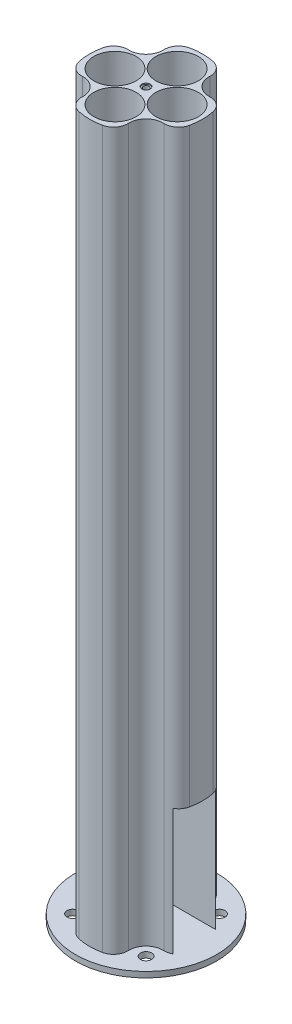
ISO-10303-21;
HEADER;
FILE_DESCRIPTION(('STEP AP214'),'2;1');
FILE_NAME('part.step','',(''),(''),'','','');
FILE_SCHEMA(('AUTOMOTIVE_DESIGN { 1 0 10303 214 1 1 1 1 }'));
ENDSEC;
DATA;
#1=APPLICATION_CONTEXT('core data for automotive mechanical design processes');
#2=APPLICATION_PROTOCOL_DEFINITION('international standard','automotive_design',2000,#1);
#3=PRODUCT_CONTEXT('',#1,'mechanical');
#4=PRODUCT('Part','Part','',(#3));
#5=PRODUCT_RELATED_PRODUCT_CATEGORY('part','',(#4));
#6=PRODUCT_DEFINITION_FORMATION('','',#4);
#7=PRODUCT_DEFINITION_CONTEXT('part definition',#1,'design');
#8=PRODUCT_DEFINITION('design','',#6,#7);
#9=PRODUCT_DEFINITION_SHAPE('','',#8);
#10=(LENGTH_UNIT() NAMED_UNIT(*) SI_UNIT(.MILLI.,.METRE.));
#11=(NAMED_UNIT(*) PLANE_ANGLE_UNIT() SI_UNIT($,.RADIAN.));
#12=(NAMED_UNIT(*) SI_UNIT($,.STERADIAN.) SOLID_ANGLE_UNIT());
#13=UNCERTAINTY_MEASURE_WITH_UNIT(LENGTH_MEASURE(1.E-05),#10,'distance_accuracy_value','');
#14=(GEOMETRIC_REPRESENTATION_CONTEXT(3) GLOBAL_UNCERTAINTY_ASSIGNED_CONTEXT((#13)) GLOBAL_UNIT_ASSIGNED_CONTEXT((#10,
#11,#12)) REPRESENTATION_CONTEXT('',''));
#15=CARTESIAN_POINT('',(0.,0.,0.));
#16=DIRECTION('',(0.,0.,1.));
#17=DIRECTION('',(1.,0.,0.));
#18=AXIS2_PLACEMENT_3D('',#15,#16,#17);
#19=CARTESIAN_POINT('',(73.3291144916706,0.,-15.7429656630339));
#20=DIRECTION('',(0.,-1.,0.));
#21=DIRECTION('',(0.,0.,-1.));
#22=AXIS2_PLACEMENT_3D('',#19,#20,#21);
#23=CYLINDRICAL_SURFACE('',#22,25.);
#24=DIRECTION('',(0.,-1.,0.));
#25=VECTOR('',#24,1.);
#26=CARTESIAN_POINT('',(97.7721526555608,1120.,-20.9906208840452));
#27=LINE('',#26,#25);
#28=CARTESIAN_POINT('',(97.7721526555608,10.,-20.9906208840452));
#29=VERTEX_POINT('',#28);
#30=CARTESIAN_POINT('',(97.7721526555608,1055.,-20.9906208840452));
#31=VERTEX_POINT('',#30);
#32=EDGE_CURVE('E367',#29,#31,#27,.F.);
#33=ORIENTED_EDGE('',*,*,#32,.F.);
#34=CARTESIAN_POINT('',(73.3291144916706,10.,-15.7429656630339));
#35=DIRECTION('',(0.,-1.,0.));
#36=DIRECTION('',(0.,0.,-1.));
#37=AXIS2_PLACEMENT_3D('',#34,#35,#36);
#38=CIRCLE('',#37,25.);
#39=CARTESIAN_POINT('',(85.642987028776,10.,-37.5));
#40=VERTEX_POINT('',#39);
#41=EDGE_CURVE('E404',#29,#40,#38,.F.);
#42=ORIENTED_EDGE('',*,*,#41,.T.);
#43=DIRECTION('',(0.,-1.,0.));
#44=VECTOR('',#43,1.);
#45=CARTESIAN_POINT('',(85.642987028776,0.,-37.5));
#46=LINE('',#45,#44);
#47=CARTESIAN_POINT('',(85.642987028776,-213.21458,-37.5));
#48=VERTEX_POINT('',#47);
#49=EDGE_CURVE('E215',#40,#48,#46,.T.);
#50=ORIENTED_EDGE('',*,*,#49,.T.);
#51=CARTESIAN_POINT('',(73.3291144916706,-213.21458,-15.7429656630339));
#52=DIRECTION('',(0.,-1.,0.));
#53=DIRECTION('',(0.,0.,-1.));
#54=AXIS2_PLACEMENT_3D('',#51,#52,#53);
#55=CIRCLE('',#54,25.);
#56=CARTESIAN_POINT('',(72.1395659128402,-213.21458,-40.7146491100625));
#57=VERTEX_POINT('',#56);
#58=EDGE_CURVE('E226',#48,#57,#55,.F.);
#59=ORIENTED_EDGE('',*,*,#58,.T.);
#60=DIRECTION('',(0.,1.,0.));
#61=VECTOR('',#60,1.);
#62=CARTESIAN_POINT('',(72.1395659128402,0.,-40.7146491100625));
#63=LINE('',#62,#61);
#64=CARTESIAN_POINT('',(72.1395659128402,1055.,-40.7146491100625));
#65=VERTEX_POINT('',#64);
#66=EDGE_CURVE('E359',#65,#57,#63,.F.);
#67=ORIENTED_EDGE('',*,*,#66,.F.);
#68=CARTESIAN_POINT('',(73.3291144916706,1055.,-15.7429656630339));
#69=DIRECTION('',(0.,-1.,0.));
#70=DIRECTION('',(0.,0.,-1.));
#71=AXIS2_PLACEMENT_3D('',#68,#69,#70);
#72=CIRCLE('',#71,25.);
#73=EDGE_CURVE('E290',#31,#65,#72,.F.);
#74=ORIENTED_EDGE('',*,*,#73,.F.);
#75=EDGE_LOOP('',(#33,#42,#50,#59,#67,#74));
#76=FACE_BOUND('',#75,.T.);
#77=ADVANCED_FACE('F65',(#76),#23,.T.);
#78=CARTESIAN_POINT('',(-73.3291144916707,1120.,-15.7429656630334));
#79=DIRECTION('',(0.,-1.,0.));
#80=DIRECTION('',(0.,0.,-1.));
#81=AXIS2_PLACEMENT_3D('',#78,#79,#80);
#82=CYLINDRICAL_SURFACE('',#81,25.);
#83=DIRECTION('',(0.,-1.,0.));
#84=VECTOR('',#83,1.);
#85=CARTESIAN_POINT('',(-85.6429870287752,1120.,-37.5));
#86=LINE('',#85,#84);
#87=CARTESIAN_POINT('',(-85.6429870287752,-213.21458,-37.5));
#88=VERTEX_POINT('',#87);
#89=CARTESIAN_POINT('',(-85.6429870287752,10.,-37.5));
#90=VERTEX_POINT('',#89);
#91=EDGE_CURVE('E205',#88,#90,#86,.F.);
#92=ORIENTED_EDGE('',*,*,#91,.T.);
#93=CARTESIAN_POINT('',(-73.3291144916707,10.,-15.7429656630334));
#94=DIRECTION('',(0.,-1.,0.));
#95=DIRECTION('',(0.,0.,-1.));
#96=AXIS2_PLACEMENT_3D('',#93,#94,#95);
#97=CIRCLE('',#96,25.);
#98=CARTESIAN_POINT('',(-97.772152655561,10.,-20.9906208840445));
#99=VERTEX_POINT('',#98);
#100=EDGE_CURVE('E388',#90,#99,#97,.F.);
#101=ORIENTED_EDGE('',*,*,#100,.T.);
#102=DIRECTION('',(0.,-1.,0.));
#103=VECTOR('',#102,1.);
#104=CARTESIAN_POINT('',(-97.772152655561,1120.,-20.9906208840445));
#105=LINE('',#104,#103);
#106=CARTESIAN_POINT('',(-97.772152655561,1055.,-20.9906208840445));
#107=VERTEX_POINT('',#106);
#108=EDGE_CURVE('E345',#107,#99,#105,.T.);
#109=ORIENTED_EDGE('',*,*,#108,.F.);
#110=CARTESIAN_POINT('',(-73.3291144916707,1055.,-15.7429656630334));
#111=DIRECTION('',(0.,-1.,0.));
#112=DIRECTION('',(0.,0.,-1.));
#113=AXIS2_PLACEMENT_3D('',#110,#111,#112);
#114=CIRCLE('',#113,25.);
#115=CARTESIAN_POINT('',(-72.1395659128405,1055.,-40.714649110062));
#116=VERTEX_POINT('',#115);
#117=EDGE_CURVE('E302',#116,#107,#114,.F.);
#118=ORIENTED_EDGE('',*,*,#117,.F.);
#119=DIRECTION('',(0.,1.,0.));
#120=VECTOR('',#119,1.);
#121=CARTESIAN_POINT('',(-72.1395659128405,0.,-40.714649110062));
#122=LINE('',#121,#120);
#123=CARTESIAN_POINT('',(-72.1395659128405,-213.21458,-40.714649110062));
#124=VERTEX_POINT('',#123);
#125=EDGE_CURVE('E232',#124,#116,#122,.T.);
#126=ORIENTED_EDGE('',*,*,#125,.F.);
#127=CARTESIAN_POINT('',(-73.3291144916707,-213.21458,-15.7429656630334));
#128=DIRECTION('',(0.,-1.,0.));
#129=DIRECTION('',(0.,0.,-1.));
#130=AXIS2_PLACEMENT_3D('',#127,#128,#129);
#131=CIRCLE('',#130,25.);
#132=EDGE_CURVE('E224',#124,#88,#131,.F.);
#133=ORIENTED_EDGE('',*,*,#132,.T.);
#134=EDGE_LOOP('',(#92,#101,#109,#118,#126,#133));
#135=FACE_BOUND('',#134,.T.);
#136=ADVANCED_FACE('F230',(#135),#82,.T.);
#137=CARTESIAN_POINT('',(0.,1120.,0.));
#138=DIRECTION('',(0.,-1.,0.));
#139=DIRECTION('',(0.,0.,-1.));
#140=AXIS2_PLACEMENT_3D('',#137,#138,#139);
#141=CYLINDRICAL_SURFACE('',#140,100.);
#142=CARTESIAN_POINT('',(0.,10.,0.));
#143=DIRECTION('',(0.,-1.,0.));
#144=DIRECTION('',(0.,0.,-1.));
#145=AXIS2_PLACEMENT_3D('',#142,#143,#144);
#146=CIRCLE('',#145,100.);
#147=CARTESIAN_POINT('',(97.7721526555608,10.,20.9906208840452));
#148=VERTEX_POINT('',#147);
#149=EDGE_CURVE('E402',#29,#148,#146,.T.);
#150=ORIENTED_EDGE('',*,*,#149,.F.);
#151=ORIENTED_EDGE('',*,*,#32,.T.);
#152=CARTESIAN_POINT('',(0.,1055.,0.));
#153=DIRECTION('',(0.,-1.,0.));
#154=DIRECTION('',(0.,0.,-1.));
#155=AXIS2_PLACEMENT_3D('',#152,#153,#154);
#156=CIRCLE('',#155,100.);
#157=CARTESIAN_POINT('',(97.7721526555608,1055.,20.9906208840452));
#158=VERTEX_POINT('',#157);
#159=EDGE_CURVE('E287',#31,#158,#156,.T.);
#160=ORIENTED_EDGE('',*,*,#159,.T.);
#161=DIRECTION('',(0.,-1.,0.));
#162=VECTOR('',#161,1.);
#163=CARTESIAN_POINT('',(97.7721526555608,1120.,20.9906208840452));
#164=LINE('',#163,#162);
#165=EDGE_CURVE('E364',#158,#148,#164,.T.);
#166=ORIENTED_EDGE('',*,*,#165,.T.);
#167=EDGE_LOOP('',(#150,#151,#160,#166));
#168=FACE_BOUND('',#167,.T.);
#169=ADVANCED_FACE('F438',(#168),#141,.T.);
#170=CARTESIAN_POINT('',(0.,10.,0.));
#171=DIRECTION('',(0.,-1.,0.));
#172=DIRECTION('',(0.,0.,-1.));
#173=AXIS2_PLACEMENT_3D('',#170,#171,#172);
#174=CIRCLE('',#173,100.);
#175=CARTESIAN_POINT('',(-97.772152655561,10.,20.9906208840445));
#176=VERTEX_POINT('',#175);
#177=EDGE_CURVE('E386',#176,#99,#174,.T.);
#178=ORIENTED_EDGE('',*,*,#177,.F.);
#179=DIRECTION('',(0.,-1.,0.));
#180=VECTOR('',#179,1.);
#181=CARTESIAN_POINT('',(-97.772152655561,1120.,20.9906208840446));
#182=LINE('',#181,#180);
#183=CARTESIAN_POINT('',(-97.772152655561,1055.,20.9906208840446));
#184=VERTEX_POINT('',#183);
#185=EDGE_CURVE('E348',#176,#184,#182,.F.);
#186=ORIENTED_EDGE('',*,*,#185,.T.);
#187=CARTESIAN_POINT('',(0.,1055.,0.));
#188=DIRECTION('',(0.,-1.,0.));
#189=DIRECTION('',(0.,0.,-1.));
#190=AXIS2_PLACEMENT_3D('',#187,#188,#189);
#191=CIRCLE('',#190,100.);
#192=EDGE_CURVE('E297',#184,#107,#191,.T.);
#193=ORIENTED_EDGE('',*,*,#192,.T.);
#194=ORIENTED_EDGE('',*,*,#108,.T.);
#195=EDGE_LOOP('',(#178,#186,#193,#194));
#196=FACE_BOUND('',#195,.T.);
#197=ADVANCED_FACE('F381',(#196),#141,.T.);
#198=CARTESIAN_POINT('',(0.,-79.9999999999998,0.));
#199=DIRECTION('',(0.,1.,0.));
#200=DIRECTION('',(0.,0.,1.));
#201=AXIS2_PLACEMENT_3D('',#198,#199,#200);
#202=CYLINDRICAL_SURFACE('',#201,5.);
#203=CARTESIAN_POINT('',(0.,1053.,0.));
#204=DIRECTION('',(0.,1.,0.));
#205=DIRECTION('',(0.,0.,1.));
#206=AXIS2_PLACEMENT_3D('',#203,#204,#205);
#207=CIRCLE('',#206,5.);
#208=CARTESIAN_POINT('',(0.,1053.,5.));
#209=VERTEX_POINT('',#208);
#210=EDGE_CURVE('E271',#209,#209,#207,.F.);
#211=ORIENTED_EDGE('',*,*,#210,.F.);
#212=EDGE_LOOP('',(#211));
#213=FACE_BOUND('',#212,.T.);
#214=CARTESIAN_POINT('',(0.,10.,0.));
#215=DIRECTION('',(0.,-1.,0.));
#216=DIRECTION('',(0.,0.,-1.));
#217=AXIS2_PLACEMENT_3D('',#214,#215,#216);
#218=CIRCLE('',#217,5.);
#219=CARTESIAN_POINT('',(0.,10.,-5.));
#220=VERTEX_POINT('',#219);
#221=EDGE_CURVE('E69',#220,#220,#218,.F.);
#222=ORIENTED_EDGE('',*,*,#221,.F.);
#223=EDGE_LOOP('',(#222));
#224=FACE_BOUND('',#223,.T.);
#225=ADVANCED_FACE('F377',(#213,#224),#202,.F.);
#226=CARTESIAN_POINT('',(-73.3291144916707,0.,15.7429656630334));
#227=DIRECTION('',(0.,-1.,0.));
#228=DIRECTION('',(0.,0.,-1.));
#229=AXIS2_PLACEMENT_3D('',#226,#227,#228);
#230=CYLINDRICAL_SURFACE('',#229,25.);
#231=DIRECTION('',(0.,-1.,0.));
#232=VECTOR('',#231,1.);
#233=CARTESIAN_POINT('',(-85.6429870287752,0.,37.5));
#234=LINE('',#233,#232);
#235=CARTESIAN_POINT('',(-85.6429870287752,-213.21458,37.5));
#236=VERTEX_POINT('',#235);
#237=CARTESIAN_POINT('',(-85.6429870287752,10.,37.5));
#238=VERTEX_POINT('',#237);
#239=EDGE_CURVE('E387',#236,#238,#234,.F.);
#240=ORIENTED_EDGE('',*,*,#239,.F.);
#241=CARTESIAN_POINT('',(-73.3291144916707,-213.21458,15.7429656630334));
#242=DIRECTION('',(0.,-1.,0.));
#243=DIRECTION('',(0.,0.,-1.));
#244=AXIS2_PLACEMENT_3D('',#241,#242,#243);
#245=CIRCLE('',#244,25.);
#246=CARTESIAN_POINT('',(-72.1395659128405,-213.21458,40.714649110062));
#247=VERTEX_POINT('',#246);
#248=EDGE_CURVE('E82',#236,#247,#245,.F.);
#249=ORIENTED_EDGE('',*,*,#248,.T.);
#250=DIRECTION('',(0.,1.,0.));
#251=VECTOR('',#250,1.);
#252=CARTESIAN_POINT('',(-72.1395659128405,0.,40.714649110062));
#253=LINE('',#252,#251);
#254=CARTESIAN_POINT('',(-72.1395659128405,1055.,40.714649110062));
#255=VERTEX_POINT('',#254);
#256=EDGE_CURVE('E336',#255,#247,#253,.F.);
#257=ORIENTED_EDGE('',*,*,#256,.F.);
#258=CARTESIAN_POINT('',(-73.3291144916707,1055.,15.7429656630334));
#259=DIRECTION('',(0.,-1.,0.));
#260=DIRECTION('',(0.,0.,-1.));
#261=AXIS2_PLACEMENT_3D('',#258,#259,#260);
#262=CIRCLE('',#261,25.);
#263=EDGE_CURVE('E292',#184,#255,#262,.F.);
#264=ORIENTED_EDGE('',*,*,#263,.F.);
#265=ORIENTED_EDGE('',*,*,#185,.F.);
#266=CARTESIAN_POINT('',(-73.3291144916707,10.,15.7429656630334));
#267=DIRECTION('',(0.,-1.,0.));
#268=DIRECTION('',(0.,0.,-1.));
#269=AXIS2_PLACEMENT_3D('',#266,#267,#268);
#270=CIRCLE('',#269,25.);
#271=EDGE_CURVE('E399',#176,#238,#270,.F.);
#272=ORIENTED_EDGE('',*,*,#271,.T.);
#273=EDGE_LOOP('',(#240,#249,#257,#264,#265,#272));
#274=FACE_BOUND('',#273,.T.);
#275=ADVANCED_FACE('F380',(#274),#230,.T.);
#276=CARTESIAN_POINT('',(-15.7429656630342,1120.,73.3291144916706));
#277=DIRECTION('',(0.,-1.,0.));
#278=DIRECTION('',(0.,0.,-1.));
#279=AXIS2_PLACEMENT_3D('',#276,#277,#278);
#280=CYLINDRICAL_SURFACE('',#279,25.);
#281=DIRECTION('',(0.,1.,0.));
#282=VECTOR('',#281,1.);
#283=CARTESIAN_POINT('',(-40.7146491100628,0.,72.1395659128401));
#284=LINE('',#283,#282);
#285=CARTESIAN_POINT('',(-40.7146491100628,-213.21458,72.1395659128401));
#286=VERTEX_POINT('',#285);
#287=CARTESIAN_POINT('',(-40.7146491100628,1055.,72.1395659128401));
#288=VERTEX_POINT('',#287);
#289=EDGE_CURVE('E338',#286,#288,#284,.T.);
#290=ORIENTED_EDGE('',*,*,#289,.F.);
#291=CARTESIAN_POINT('',(-15.7429656630342,-213.21458,73.3291144916706));
#292=DIRECTION('',(0.,-1.,0.));
#293=DIRECTION('',(0.,0.,-1.));
#294=AXIS2_PLACEMENT_3D('',#291,#292,#293);
#295=CIRCLE('',#294,25.);
#296=CARTESIAN_POINT('',(-20.9906208840455,-213.21458,97.7721526555607));
#297=VERTEX_POINT('',#296);
#298=EDGE_CURVE('E246',#286,#297,#295,.F.);
#299=ORIENTED_EDGE('',*,*,#298,.T.);
#300=DIRECTION('',(0.,-1.,0.));
#301=VECTOR('',#300,1.);
#302=CARTESIAN_POINT('',(-20.9906208840455,1120.,97.7721526555607));
#303=LINE('',#302,#301);
#304=CARTESIAN_POINT('',(-20.9906208840455,1055.,97.7721526555607));
#305=VERTEX_POINT('',#304);
#306=EDGE_CURVE('E342',#305,#297,#303,.T.);
#307=ORIENTED_EDGE('',*,*,#306,.F.);
#308=CARTESIAN_POINT('',(-15.7429656630342,1055.,73.3291144916706));
#309=DIRECTION('',(0.,-1.,0.));
#310=DIRECTION('',(0.,0.,-1.));
#311=AXIS2_PLACEMENT_3D('',#308,#309,#310);
#312=CIRCLE('',#311,25.);
#313=EDGE_CURVE('E282',#288,#305,#312,.F.);
#314=ORIENTED_EDGE('',*,*,#313,.F.);
#315=EDGE_LOOP('',(#290,#299,#307,#314));
#316=FACE_BOUND('',#315,.T.);
#317=ADVANCED_FACE('F660',(#316),#280,.T.);
#318=CARTESIAN_POINT('',(-70.7106781186551,0.,70.7106781186544));
#319=DIRECTION('',(0.,1.,0.));
#320=DIRECTION('',(0.,0.,1.));
#321=AXIS2_PLACEMENT_3D('',#318,#319,#320);
#322=CYLINDRICAL_SURFACE('',#321,30.0300429006135);
#323=CARTESIAN_POINT('',(-70.7106781186551,-213.21458,70.7106781186544));
#324=DIRECTION('',(0.,-1.,0.));
#325=DIRECTION('',(0.,0.,-1.));
#326=AXIS2_PLACEMENT_3D('',#323,#324,#325);
#327=CIRCLE('',#326,30.0300429006135);
#328=EDGE_CURVE('E89',#286,#247,#327,.F.);
#329=ORIENTED_EDGE('',*,*,#328,.F.);
#330=ORIENTED_EDGE('',*,*,#289,.T.);
#331=CARTESIAN_POINT('',(-70.7106781186551,1055.,70.7106781186544));
#332=DIRECTION('',(0.,-1.,0.));
#333=DIRECTION('',(0.,0.,-1.));
#334=AXIS2_PLACEMENT_3D('',#331,#332,#333);
#335=CIRCLE('',#334,30.0300429006135);
#336=EDGE_CURVE('E284',#288,#255,#335,.F.);
#337=ORIENTED_EDGE('',*,*,#336,.T.);
#338=ORIENTED_EDGE('',*,*,#256,.T.);
#339=EDGE_LOOP('',(#329,#330,#337,#338));
#340=FACE_BOUND('',#339,.T.);
#341=ADVANCED_FACE('F453',(#340),#322,.F.);
#342=CARTESIAN_POINT('',(15.7429656630337,0.,73.3291144916707));
#343=DIRECTION('',(0.,-1.,0.));
#344=DIRECTION('',(0.,0.,-1.));
#345=AXIS2_PLACEMENT_3D('',#342,#343,#344);
#346=CYLINDRICAL_SURFACE('',#345,25.);
#347=DIRECTION('',(0.,-1.,0.));
#348=VECTOR('',#347,1.);
#349=CARTESIAN_POINT('',(20.9906208840449,1120.,97.7721526555609));
#350=LINE('',#349,#348);
#351=CARTESIAN_POINT('',(20.9906208840449,-213.21458,97.7721526555609));
#352=VERTEX_POINT('',#351);
#353=CARTESIAN_POINT('',(20.9906208840449,1055.,97.7721526555609));
#354=VERTEX_POINT('',#353);
#355=EDGE_CURVE('E340',#352,#354,#350,.F.);
#356=ORIENTED_EDGE('',*,*,#355,.F.);
#357=CARTESIAN_POINT('',(15.7429656630337,-213.21458,73.3291144916707));
#358=DIRECTION('',(0.,-1.,0.));
#359=DIRECTION('',(0.,0.,-1.));
#360=AXIS2_PLACEMENT_3D('',#357,#358,#359);
#361=CIRCLE('',#360,25.);
#362=CARTESIAN_POINT('',(40.7146491100623,-213.21458,72.1395659128404));
#363=VERTEX_POINT('',#362);
#364=EDGE_CURVE('E256',#352,#363,#361,.F.);
#365=ORIENTED_EDGE('',*,*,#364,.T.);
#366=DIRECTION('',(0.,1.,0.));
#367=VECTOR('',#366,1.);
#368=CARTESIAN_POINT('',(40.7146491100623,0.,72.1395659128404));
#369=LINE('',#368,#367);
#370=CARTESIAN_POINT('',(40.7146491100623,1055.,72.1395659128404));
#371=VERTEX_POINT('',#370);
#372=EDGE_CURVE('E369',#371,#363,#369,.F.);
#373=ORIENTED_EDGE('',*,*,#372,.F.);
#374=CARTESIAN_POINT('',(15.7429656630337,1055.,73.3291144916707));
#375=DIRECTION('',(0.,-1.,0.));
#376=DIRECTION('',(0.,0.,-1.));
#377=AXIS2_PLACEMENT_3D('',#374,#375,#376);
#378=CIRCLE('',#377,25.);
#379=EDGE_CURVE('E12',#354,#371,#378,.F.);
#380=ORIENTED_EDGE('',*,*,#379,.F.);
#381=EDGE_LOOP('',(#356,#365,#373,#380));
#382=FACE_BOUND('',#381,.T.);
#383=ADVANCED_FACE('F67',(#382),#346,.T.);
#384=CARTESIAN_POINT('',(73.3291144916706,1120.,15.7429656630339));
#385=DIRECTION('',(0.,-1.,0.));
#386=DIRECTION('',(0.,0.,-1.));
#387=AXIS2_PLACEMENT_3D('',#384,#385,#386);
#388=CYLINDRICAL_SURFACE('',#387,25.);
#389=DIRECTION('',(0.,-1.,0.));
#390=VECTOR('',#389,1.);
#391=CARTESIAN_POINT('',(85.642987028776,1120.,37.5));
#392=LINE('',#391,#390);
#393=CARTESIAN_POINT('',(85.642987028776,10.,37.5));
#394=VERTEX_POINT('',#393);
#395=CARTESIAN_POINT('',(85.642987028776,-213.21458,37.5));
#396=VERTEX_POINT('',#395);
#397=EDGE_CURVE('E390',#394,#396,#392,.T.);
#398=ORIENTED_EDGE('',*,*,#397,.F.);
#399=CARTESIAN_POINT('',(73.3291144916706,10.,15.7429656630339));
#400=DIRECTION('',(0.,-1.,0.));
#401=DIRECTION('',(0.,0.,-1.));
#402=AXIS2_PLACEMENT_3D('',#399,#400,#401);
#403=CIRCLE('',#402,25.);
#404=EDGE_CURVE('E407',#394,#148,#403,.F.);
#405=ORIENTED_EDGE('',*,*,#404,.T.);
#406=ORIENTED_EDGE('',*,*,#165,.F.);
#407=CARTESIAN_POINT('',(73.3291144916706,1055.,15.7429656630339));
#408=DIRECTION('',(0.,-1.,0.));
#409=DIRECTION('',(0.,0.,-1.));
#410=AXIS2_PLACEMENT_3D('',#407,#408,#409);
#411=CIRCLE('',#410,25.);
#412=CARTESIAN_POINT('',(72.1395659128402,1055.,40.7146491100625));
#413=VERTEX_POINT('',#412);
#414=EDGE_CURVE('E280',#413,#158,#411,.F.);
#415=ORIENTED_EDGE('',*,*,#414,.F.);
#416=DIRECTION('',(0.,1.,0.));
#417=VECTOR('',#416,1.);
#418=CARTESIAN_POINT('',(72.1395659128402,0.,40.7146491100625));
#419=LINE('',#418,#417);
#420=CARTESIAN_POINT('',(72.1395659128402,-213.21458,40.7146491100625));
#421=VERTEX_POINT('',#420);
#422=EDGE_CURVE('E74',#421,#413,#419,.T.);
#423=ORIENTED_EDGE('',*,*,#422,.F.);
#424=CARTESIAN_POINT('',(73.3291144916706,-213.21458,15.7429656630339));
#425=DIRECTION('',(0.,-1.,0.));
#426=DIRECTION('',(0.,0.,-1.));
#427=AXIS2_PLACEMENT_3D('',#424,#425,#426);
#428=CIRCLE('',#427,25.);
#429=EDGE_CURVE('E264',#421,#396,#428,.F.);
#430=ORIENTED_EDGE('',*,*,#429,.T.);
#431=EDGE_LOOP('',(#398,#405,#406,#415,#423,#430));
#432=FACE_BOUND('',#431,.T.);
#433=ADVANCED_FACE('F444',(#432),#388,.T.);
#434=CARTESIAN_POINT('',(70.7106781186546,0.,70.7106781186549));
#435=DIRECTION('',(0.,1.,0.));
#436=DIRECTION('',(0.,0.,1.));
#437=AXIS2_PLACEMENT_3D('',#434,#435,#436);
#438=CYLINDRICAL_SURFACE('',#437,30.0300429006135);
#439=CARTESIAN_POINT('',(70.7106781186546,-213.21458,70.7106781186549));
#440=DIRECTION('',(0.,-1.,0.));
#441=DIRECTION('',(0.,0.,-1.));
#442=AXIS2_PLACEMENT_3D('',#439,#440,#441);
#443=CIRCLE('',#442,30.0300429006135);
#444=EDGE_CURVE('E261',#421,#363,#443,.F.);
#445=ORIENTED_EDGE('',*,*,#444,.F.);
#446=ORIENTED_EDGE('',*,*,#422,.T.);
#447=CARTESIAN_POINT('',(70.7106781186546,1055.,70.7106781186549));
#448=DIRECTION('',(0.,-1.,0.));
#449=DIRECTION('',(0.,0.,-1.));
#450=AXIS2_PLACEMENT_3D('',#447,#448,#449);
#451=CIRCLE('',#450,30.0300429006135);
#452=EDGE_CURVE('E274',#413,#371,#451,.F.);
#453=ORIENTED_EDGE('',*,*,#452,.T.);
#454=ORIENTED_EDGE('',*,*,#372,.T.);
#455=EDGE_LOOP('',(#445,#446,#453,#454));
#456=FACE_BOUND('',#455,.T.);
#457=ADVANCED_FACE('F446',(#456),#438,.F.);
#458=CARTESIAN_POINT('',(15.7429656630337,1120.,-73.3291144916707));
#459=DIRECTION('',(0.,-1.,0.));
#460=DIRECTION('',(0.,0.,-1.));
#461=AXIS2_PLACEMENT_3D('',#458,#459,#460);
#462=CYLINDRICAL_SURFACE('',#461,25.);
#463=DIRECTION('',(0.,1.,0.));
#464=VECTOR('',#463,1.);
#465=CARTESIAN_POINT('',(40.7146491100623,0.,-72.1395659128404));
#466=LINE('',#465,#464);
#467=CARTESIAN_POINT('',(40.7146491100623,-213.21458,-72.1395659128404));
#468=VERTEX_POINT('',#467);
#469=CARTESIAN_POINT('',(40.7146491100623,1055.,-72.1395659128404));
#470=VERTEX_POINT('',#469);
#471=EDGE_CURVE('E362',#468,#470,#466,.T.);
#472=ORIENTED_EDGE('',*,*,#471,.F.);
#473=CARTESIAN_POINT('',(15.7429656630337,-213.21458,-73.3291144916707));
#474=DIRECTION('',(0.,-1.,0.));
#475=DIRECTION('',(0.,0.,-1.));
#476=AXIS2_PLACEMENT_3D('',#473,#474,#475);
#477=CIRCLE('',#476,25.);
#478=CARTESIAN_POINT('',(20.9906208840449,-213.21458,-97.7721526555609));
#479=VERTEX_POINT('',#478);
#480=EDGE_CURVE('E254',#468,#479,#477,.F.);
#481=ORIENTED_EDGE('',*,*,#480,.T.);
#482=DIRECTION('',(0.,-1.,0.));
#483=VECTOR('',#482,1.);
#484=CARTESIAN_POINT('',(20.9906208840449,1120.,-97.7721526555609));
#485=LINE('',#484,#483);
#486=CARTESIAN_POINT('',(20.9906208840449,1055.,-97.7721526555609));
#487=VERTEX_POINT('',#486);
#488=EDGE_CURVE('E354',#487,#479,#485,.T.);
#489=ORIENTED_EDGE('',*,*,#488,.F.);
#490=CARTESIAN_POINT('',(15.7429656630337,1055.,-73.3291144916707));
#491=DIRECTION('',(0.,-1.,0.));
#492=DIRECTION('',(0.,0.,-1.));
#493=AXIS2_PLACEMENT_3D('',#490,#491,#492);
#494=CIRCLE('',#493,25.);
#495=EDGE_CURVE('E300',#470,#487,#494,.F.);
#496=ORIENTED_EDGE('',*,*,#495,.F.);
#497=EDGE_LOOP('',(#472,#481,#489,#496));
#498=FACE_BOUND('',#497,.T.);
#499=ADVANCED_FACE('F442',(#498),#462,.T.);
#500=CARTESIAN_POINT('',(70.7106781186546,0.,-70.7106781186549));
#501=DIRECTION('',(0.,1.,0.));
#502=DIRECTION('',(0.,0.,1.));
#503=AXIS2_PLACEMENT_3D('',#500,#501,#502);
#504=CYLINDRICAL_SURFACE('',#503,30.0300429006135);
#505=CARTESIAN_POINT('',(70.7106781186546,-213.21458,-70.7106781186549));
#506=DIRECTION('',(0.,-1.,0.));
#507=DIRECTION('',(0.,0.,-1.));
#508=AXIS2_PLACEMENT_3D('',#505,#506,#507);
#509=CIRCLE('',#508,30.0300429006135);
#510=EDGE_CURVE('E258',#468,#57,#509,.F.);
#511=ORIENTED_EDGE('',*,*,#510,.F.);
#512=ORIENTED_EDGE('',*,*,#471,.T.);
#513=CARTESIAN_POINT('',(70.7106781186546,1055.,-70.7106781186549));
#514=DIRECTION('',(0.,-1.,0.));
#515=DIRECTION('',(0.,0.,-1.));
#516=AXIS2_PLACEMENT_3D('',#513,#514,#515);
#517=CIRCLE('',#516,30.0300429006135);
#518=EDGE_CURVE('E294',#470,#65,#517,.F.);
#519=ORIENTED_EDGE('',*,*,#518,.T.);
#520=ORIENTED_EDGE('',*,*,#66,.T.);
#521=EDGE_LOOP('',(#511,#512,#519,#520));
#522=FACE_BOUND('',#521,.T.);
#523=ADVANCED_FACE('F692',(#522),#504,.F.);
#524=CARTESIAN_POINT('',(-15.7429656630342,0.,-73.3291144916705));
#525=DIRECTION('',(0.,-1.,0.));
#526=DIRECTION('',(0.,0.,-1.));
#527=AXIS2_PLACEMENT_3D('',#524,#525,#526);
#528=CYLINDRICAL_SURFACE('',#527,25.);
#529=DIRECTION('',(0.,-1.,0.));
#530=VECTOR('',#529,1.);
#531=CARTESIAN_POINT('',(-20.9906208840456,1120.,-97.7721526555607));
#532=LINE('',#531,#530);
#533=CARTESIAN_POINT('',(-20.9906208840456,-213.21458,-97.7721526555607));
#534=VERTEX_POINT('',#533);
#535=CARTESIAN_POINT('',(-20.9906208840456,1055.,-97.7721526555607));
#536=VERTEX_POINT('',#535);
#537=EDGE_CURVE('E357',#534,#536,#532,.F.);
#538=ORIENTED_EDGE('',*,*,#537,.F.);
#539=CARTESIAN_POINT('',(-15.7429656630342,-213.21458,-73.3291144916705));
#540=DIRECTION('',(0.,-1.,0.));
#541=DIRECTION('',(0.,0.,-1.));
#542=AXIS2_PLACEMENT_3D('',#539,#540,#541);
#543=CIRCLE('',#542,25.);
#544=CARTESIAN_POINT('',(-40.7146491100628,-213.21458,-72.1395659128401));
#545=VERTEX_POINT('',#544);
#546=EDGE_CURVE('E243',#534,#545,#543,.F.);
#547=ORIENTED_EDGE('',*,*,#546,.T.);
#548=DIRECTION('',(0.,1.,0.));
#549=VECTOR('',#548,1.);
#550=CARTESIAN_POINT('',(-40.7146491100628,0.,-72.1395659128401));
#551=LINE('',#550,#549);
#552=CARTESIAN_POINT('',(-40.7146491100628,1055.,-72.1395659128401));
#553=VERTEX_POINT('',#552);
#554=EDGE_CURVE('E350',#553,#545,#551,.F.);
#555=ORIENTED_EDGE('',*,*,#554,.F.);
#556=CARTESIAN_POINT('',(-15.7429656630342,1055.,-73.3291144916705));
#557=DIRECTION('',(0.,-1.,0.));
#558=DIRECTION('',(0.,0.,-1.));
#559=AXIS2_PLACEMENT_3D('',#556,#557,#558);
#560=CIRCLE('',#559,25.);
#561=EDGE_CURVE('E310',#536,#553,#560,.F.);
#562=ORIENTED_EDGE('',*,*,#561,.F.);
#563=EDGE_LOOP('',(#538,#547,#555,#562));
#564=FACE_BOUND('',#563,.T.);
#565=ADVANCED_FACE('F696',(#564),#528,.T.);
#566=CARTESIAN_POINT('',(-70.7106781186551,0.,-70.7106781186544));
#567=DIRECTION('',(0.,1.,0.));
#568=DIRECTION('',(0.,0.,1.));
#569=AXIS2_PLACEMENT_3D('',#566,#567,#568);
#570=CYLINDRICAL_SURFACE('',#569,30.0300429006135);
#571=CARTESIAN_POINT('',(-70.7106781186551,-213.21458,-70.7106781186544));
#572=DIRECTION('',(0.,-1.,0.));
#573=DIRECTION('',(0.,0.,-1.));
#574=AXIS2_PLACEMENT_3D('',#571,#572,#573);
#575=CIRCLE('',#574,30.0300429006135);
#576=EDGE_CURVE('E235',#124,#545,#575,.F.);
#577=ORIENTED_EDGE('',*,*,#576,.F.);
#578=ORIENTED_EDGE('',*,*,#125,.T.);
#579=CARTESIAN_POINT('',(-70.7106781186551,1055.,-70.7106781186544));
#580=DIRECTION('',(0.,-1.,0.));
#581=DIRECTION('',(0.,0.,-1.));
#582=AXIS2_PLACEMENT_3D('',#579,#580,#581);
#583=CIRCLE('',#582,30.0300429006135);
#584=EDGE_CURVE('E304',#116,#553,#583,.F.);
#585=ORIENTED_EDGE('',*,*,#584,.T.);
#586=ORIENTED_EDGE('',*,*,#554,.T.);
#587=EDGE_LOOP('',(#577,#578,#585,#586));
#588=FACE_BOUND('',#587,.T.);
#589=ADVANCED_FACE('F706',(#588),#570,.F.);
#590=CARTESIAN_POINT('',(0.,-213.21458,0.));
#591=DIRECTION('',(0.,-1.,0.));
#592=DIRECTION('',(0.,0.,-1.));
#593=AXIS2_PLACEMENT_3D('',#590,#591,#592);
#594=CIRCLE('',#593,100.);
#595=EDGE_CURVE('E251',#534,#479,#594,.T.);
#596=ORIENTED_EDGE('',*,*,#595,.F.);
#597=ORIENTED_EDGE('',*,*,#537,.T.);
#598=CARTESIAN_POINT('',(0.,1055.,0.));
#599=DIRECTION('',(0.,-1.,0.));
#600=DIRECTION('',(0.,0.,-1.));
#601=AXIS2_PLACEMENT_3D('',#598,#599,#600);
#602=CIRCLE('',#601,100.);
#603=EDGE_CURVE('E307',#536,#487,#602,.T.);
#604=ORIENTED_EDGE('',*,*,#603,.T.);
#605=ORIENTED_EDGE('',*,*,#488,.T.);
#606=EDGE_LOOP('',(#596,#597,#604,#605));
#607=FACE_BOUND('',#606,.T.);
#608=ADVANCED_FACE('F614',(#607),#141,.T.);
#609=CARTESIAN_POINT('',(0.,-213.21458,0.));
#610=DIRECTION('',(0.,-1.,0.));
#611=DIRECTION('',(0.,0.,-1.));
#612=AXIS2_PLACEMENT_3D('',#609,#610,#611);
#613=CIRCLE('',#612,100.);
#614=EDGE_CURVE('E248',#352,#297,#613,.T.);
#615=ORIENTED_EDGE('',*,*,#614,.F.);
#616=ORIENTED_EDGE('',*,*,#355,.T.);
#617=CARTESIAN_POINT('',(0.,1055.,0.));
#618=DIRECTION('',(0.,-1.,0.));
#619=DIRECTION('',(0.,0.,-1.));
#620=AXIS2_PLACEMENT_3D('',#617,#618,#619);
#621=CIRCLE('',#620,100.);
#622=EDGE_CURVE('E277',#354,#305,#621,.T.);
#623=ORIENTED_EDGE('',*,*,#622,.T.);
#624=ORIENTED_EDGE('',*,*,#306,.T.);
#625=EDGE_LOOP('',(#615,#616,#623,#624));
#626=FACE_BOUND('',#625,.T.);
#627=ADVANCED_FACE('F602',(#626),#141,.T.);
#628=CARTESIAN_POINT('',(0.,20.,-55.));
#629=DIRECTION('',(0.,1.,0.));
#630=DIRECTION('',(0.,0.,1.));
#631=AXIS2_PLACEMENT_3D('',#628,#629,#630);
#632=CYLINDRICAL_SURFACE('',#631,37.5);
#633=CARTESIAN_POINT('',(0.,1055.,-55.));
#634=DIRECTION('',(0.,-1.,0.));
#635=DIRECTION('',(0.,0.,-1.));
#636=AXIS2_PLACEMENT_3D('',#633,#634,#635);
#637=CIRCLE('',#636,37.5);
#638=CARTESIAN_POINT('',(0.,1055.,-92.5));
#639=VERTEX_POINT('',#638);
#640=EDGE_CURVE('E321',#639,#639,#637,.F.);
#641=ORIENTED_EDGE('',*,*,#640,.T.);
#642=EDGE_LOOP('',(#641));
#643=FACE_BOUND('',#642,.T.);
#644=CARTESIAN_POINT('',(0.,20.,-55.));
#645=DIRECTION('',(0.,1.,0.));
#646=DIRECTION('',(0.,0.,1.));
#647=AXIS2_PLACEMENT_3D('',#644,#645,#646);
#648=CIRCLE('',#647,37.5);
#649=CARTESIAN_POINT('',(0.,20.,-17.5));
#650=VERTEX_POINT('',#649);
#651=EDGE_CURVE('E331',#650,#650,#648,.T.);
#652=ORIENTED_EDGE('',*,*,#651,.F.);
#653=EDGE_LOOP('',(#652));
#654=FACE_BOUND('',#653,.T.);
#655=ADVANCED_FACE('F726',(#643,#654),#632,.F.);
#656=CARTESIAN_POINT('',(0.,20.,-55.));
#657=DIRECTION('',(0.,1.,0.));
#658=DIRECTION('',(0.,0.,1.));
#659=AXIS2_PLACEMENT_3D('',#656,#657,#658);
#660=PLANE('',#659);
#661=ORIENTED_EDGE('',*,*,#651,.T.);
#662=EDGE_LOOP('',(#661));
#663=FACE_BOUND('',#662,.T.);
#664=ADVANCED_FACE('F733',(#663),#660,.T.);
#665=CARTESIAN_POINT('',(0.,1055.,0.));
#666=DIRECTION('',(0.,-1.,0.));
#667=DIRECTION('',(0.,0.,-1.));
#668=AXIS2_PLACEMENT_3D('',#665,#666,#667);
#669=PLANE('',#668);
#670=CARTESIAN_POINT('',(0.,1055.,0.));
#671=DIRECTION('',(0.,1.,0.));
#672=DIRECTION('',(0.,0.,1.));
#673=AXIS2_PLACEMENT_3D('',#670,#671,#672);
#674=CIRCLE('',#673,7.5);
#675=CARTESIAN_POINT('',(0.,1055.,7.5));
#676=VERTEX_POINT('',#675);
#677=EDGE_CURVE('E267',#676,#676,#674,.T.);
#678=ORIENTED_EDGE('',*,*,#677,.F.);
#679=EDGE_LOOP('',(#678));
#680=FACE_BOUND('',#679,.T.);
#681=CARTESIAN_POINT('',(0.,1055.,55.));
#682=DIRECTION('',(0.,-1.,0.));
#683=DIRECTION('',(0.,0.,-1.));
#684=AXIS2_PLACEMENT_3D('',#681,#682,#683);
#685=CIRCLE('',#684,37.5);
#686=CARTESIAN_POINT('',(0.,1055.,17.5));
#687=VERTEX_POINT('',#686);
#688=EDGE_CURVE('E318',#687,#687,#685,.F.);
#689=ORIENTED_EDGE('',*,*,#688,.F.);
#690=EDGE_LOOP('',(#689));
#691=FACE_BOUND('',#690,.T.);
#692=CARTESIAN_POINT('',(-55.,1055.,0.));
#693=DIRECTION('',(0.,-1.,0.));
#694=DIRECTION('',(0.,0.,-1.));
#695=AXIS2_PLACEMENT_3D('',#692,#693,#694);
#696=CIRCLE('',#695,37.5);
#697=CARTESIAN_POINT('',(-55.,1055.,-37.5));
#698=VERTEX_POINT('',#697);
#699=EDGE_CURVE('E312',#698,#698,#696,.F.);
#700=ORIENTED_EDGE('',*,*,#699,.F.);
#701=EDGE_LOOP('',(#700));
#702=FACE_BOUND('',#701,.T.);
#703=ORIENTED_EDGE('',*,*,#561,.T.);
#704=ORIENTED_EDGE('',*,*,#584,.F.);
#705=ORIENTED_EDGE('',*,*,#117,.T.);
#706=ORIENTED_EDGE('',*,*,#192,.F.);
#707=ORIENTED_EDGE('',*,*,#263,.T.);
#708=ORIENTED_EDGE('',*,*,#336,.F.);
#709=ORIENTED_EDGE('',*,*,#313,.T.);
#710=ORIENTED_EDGE('',*,*,#622,.F.);
#711=ORIENTED_EDGE('',*,*,#379,.T.);
#712=ORIENTED_EDGE('',*,*,#452,.F.);
#713=ORIENTED_EDGE('',*,*,#414,.T.);
#714=ORIENTED_EDGE('',*,*,#159,.F.);
#715=ORIENTED_EDGE('',*,*,#73,.T.);
#716=ORIENTED_EDGE('',*,*,#518,.F.);
#717=ORIENTED_EDGE('',*,*,#495,.T.);
#718=ORIENTED_EDGE('',*,*,#603,.F.);
#719=EDGE_LOOP('',(#703,#704,#705,#706,#707,#708,#709,#710,#711,#712,#713,#714,#715,#716,#717,#718));
#720=FACE_BOUND('',#719,.T.);
#721=CARTESIAN_POINT('',(55.,1055.,0.));
#722=DIRECTION('',(0.,-1.,0.));
#723=DIRECTION('',(0.,0.,-1.));
#724=AXIS2_PLACEMENT_3D('',#721,#722,#723);
#725=CIRCLE('',#724,37.5);
#726=CARTESIAN_POINT('',(55.,1055.,-37.5));
#727=VERTEX_POINT('',#726);
#728=EDGE_CURVE('E315',#727,#727,#725,.F.);
#729=ORIENTED_EDGE('',*,*,#728,.F.);
#730=EDGE_LOOP('',(#729));
#731=FACE_BOUND('',#730,.T.);
#732=ORIENTED_EDGE('',*,*,#640,.F.);
#733=EDGE_LOOP('',(#732));
#734=FACE_BOUND('',#733,.T.);
#735=ADVANCED_FACE('F743',(#680,#691,#702,#720,#731,#734),#669,.F.);
#736=CARTESIAN_POINT('',(-55.,20.,0.));
#737=DIRECTION('',(0.,1.,0.));
#738=DIRECTION('',(0.,0.,1.));
#739=AXIS2_PLACEMENT_3D('',#736,#737,#738);
#740=PLANE('',#739);
#741=CARTESIAN_POINT('',(-55.,20.,0.));
#742=DIRECTION('',(0.,1.,0.));
#743=DIRECTION('',(0.,0.,1.));
#744=AXIS2_PLACEMENT_3D('',#741,#742,#743);
#745=CIRCLE('',#744,37.5);
#746=CARTESIAN_POINT('',(-55.,20.,37.5));
#747=VERTEX_POINT('',#746);
#748=EDGE_CURVE('E328',#747,#747,#745,.T.);
#749=ORIENTED_EDGE('',*,*,#748,.T.);
#750=EDGE_LOOP('',(#749));
#751=FACE_BOUND('',#750,.T.);
#752=ADVANCED_FACE('F753',(#751),#740,.T.);
#753=CARTESIAN_POINT('',(-55.,20.,0.));
#754=DIRECTION('',(0.,1.,0.));
#755=DIRECTION('',(0.,0.,1.));
#756=AXIS2_PLACEMENT_3D('',#753,#754,#755);
#757=CYLINDRICAL_SURFACE('',#756,37.5);
#758=ORIENTED_EDGE('',*,*,#699,.T.);
#759=EDGE_LOOP('',(#758));
#760=FACE_BOUND('',#759,.T.);
#761=ORIENTED_EDGE('',*,*,#748,.F.);
#762=EDGE_LOOP('',(#761));
#763=FACE_BOUND('',#762,.T.);
#764=ADVANCED_FACE('F763',(#760,#763),#757,.F.);
#765=CARTESIAN_POINT('',(55.,20.,0.));
#766=DIRECTION('',(0.,1.,0.));
#767=DIRECTION('',(0.,0.,1.));
#768=AXIS2_PLACEMENT_3D('',#765,#766,#767);
#769=PLANE('',#768);
#770=CARTESIAN_POINT('',(55.,20.,0.));
#771=DIRECTION('',(0.,1.,0.));
#772=DIRECTION('',(0.,0.,1.));
#773=AXIS2_PLACEMENT_3D('',#770,#771,#772);
#774=CIRCLE('',#773,37.5);
#775=CARTESIAN_POINT('',(55.,20.,37.5));
#776=VERTEX_POINT('',#775);
#777=EDGE_CURVE('E327',#776,#776,#774,.T.);
#778=ORIENTED_EDGE('',*,*,#777,.T.);
#779=EDGE_LOOP('',(#778));
#780=FACE_BOUND('',#779,.T.);
#781=ADVANCED_FACE('F770',(#780),#769,.T.);
#782=CARTESIAN_POINT('',(55.,20.,0.));
#783=DIRECTION('',(0.,1.,0.));
#784=DIRECTION('',(0.,0.,1.));
#785=AXIS2_PLACEMENT_3D('',#782,#783,#784);
#786=CYLINDRICAL_SURFACE('',#785,37.5);
#787=ORIENTED_EDGE('',*,*,#728,.T.);
#788=EDGE_LOOP('',(#787));
#789=FACE_BOUND('',#788,.T.);
#790=ORIENTED_EDGE('',*,*,#777,.F.);
#791=EDGE_LOOP('',(#790));
#792=FACE_BOUND('',#791,.T.);
#793=ADVANCED_FACE('F777',(#789,#792),#786,.F.);
#794=CARTESIAN_POINT('',(0.,20.,55.));
#795=DIRECTION('',(0.,1.,0.));
#796=DIRECTION('',(0.,0.,1.));
#797=AXIS2_PLACEMENT_3D('',#794,#795,#796);
#798=PLANE('',#797);
#799=CARTESIAN_POINT('',(0.,20.,55.));
#800=DIRECTION('',(0.,1.,0.));
#801=DIRECTION('',(0.,0.,1.));
#802=AXIS2_PLACEMENT_3D('',#799,#800,#801);
#803=CIRCLE('',#802,37.5);
#804=CARTESIAN_POINT('',(0.,20.,92.5));
#805=VERTEX_POINT('',#804);
#806=EDGE_CURVE('E324',#805,#805,#803,.T.);
#807=ORIENTED_EDGE('',*,*,#806,.T.);
#808=EDGE_LOOP('',(#807));
#809=FACE_BOUND('',#808,.T.);
#810=ADVANCED_FACE('F784',(#809),#798,.T.);
#811=CARTESIAN_POINT('',(0.,20.,55.));
#812=DIRECTION('',(0.,1.,0.));
#813=DIRECTION('',(0.,0.,1.));
#814=AXIS2_PLACEMENT_3D('',#811,#812,#813);
#815=CYLINDRICAL_SURFACE('',#814,37.5);
#816=ORIENTED_EDGE('',*,*,#688,.T.);
#817=EDGE_LOOP('',(#816));
#818=FACE_BOUND('',#817,.T.);
#819=ORIENTED_EDGE('',*,*,#806,.F.);
#820=EDGE_LOOP('',(#819));
#821=FACE_BOUND('',#820,.T.);
#822=ADVANCED_FACE('F791',(#818,#821),#815,.F.);
#823=CARTESIAN_POINT('',(0.,1053.,0.));
#824=DIRECTION('',(0.,1.,0.));
#825=DIRECTION('',(0.,0.,1.));
#826=AXIS2_PLACEMENT_3D('',#823,#824,#825);
#827=PLANE('',#826);
#828=CARTESIAN_POINT('',(0.,1053.,0.));
#829=DIRECTION('',(0.,1.,0.));
#830=DIRECTION('',(0.,0.,1.));
#831=AXIS2_PLACEMENT_3D('',#828,#829,#830);
#832=CIRCLE('',#831,7.5);
#833=CARTESIAN_POINT('',(0.,1053.,7.5));
#834=VERTEX_POINT('',#833);
#835=EDGE_CURVE('E268',#834,#834,#832,.T.);
#836=ORIENTED_EDGE('',*,*,#835,.T.);
#837=EDGE_LOOP('',(#836));
#838=FACE_BOUND('',#837,.T.);
#839=ORIENTED_EDGE('',*,*,#210,.T.);
#840=EDGE_LOOP('',(#839));
#841=FACE_BOUND('',#840,.T.);
#842=ADVANCED_FACE('F375',(#838,#841),#827,.T.);
#843=CARTESIAN_POINT('',(0.,1053.,0.));
#844=DIRECTION('',(0.,1.,0.));
#845=DIRECTION('',(0.,0.,1.));
#846=AXIS2_PLACEMENT_3D('',#843,#844,#845);
#847=CYLINDRICAL_SURFACE('',#846,7.5);
#848=ORIENTED_EDGE('',*,*,#835,.F.);
#849=EDGE_LOOP('',(#848));
#850=FACE_BOUND('',#849,.T.);
#851=ORIENTED_EDGE('',*,*,#677,.T.);
#852=EDGE_LOOP('',(#851));
#853=FACE_BOUND('',#852,.T.);
#854=ADVANCED_FACE('F419',(#850,#853),#847,.F.);
#855=CARTESIAN_POINT('',(0.,-213.21458,0.));
#856=DIRECTION('',(0.,-1.,0.));
#857=DIRECTION('',(0.,0.,-1.));
#858=AXIS2_PLACEMENT_3D('',#855,#856,#857);
#859=CYLINDRICAL_SURFACE('',#858,125.);
#860=CARTESIAN_POINT('',(0.,-213.21458,0.));
#861=DIRECTION('',(0.,-1.,0.));
#862=DIRECTION('',(0.,0.,-1.));
#863=AXIS2_PLACEMENT_3D('',#860,#861,#862);
#864=CIRCLE('',#863,125.);
#865=CARTESIAN_POINT('',(0.,-213.21458,-125.));
#866=VERTEX_POINT('',#865);
#867=EDGE_CURVE('E233',#866,#866,#864,.T.);
#868=ORIENTED_EDGE('',*,*,#867,.T.);
#869=EDGE_LOOP('',(#868));
#870=FACE_BOUND('',#869,.T.);
#871=CARTESIAN_POINT('',(0.,-223.21458,0.));
#872=DIRECTION('',(0.,-1.,0.));
#873=DIRECTION('',(0.,0.,-1.));
#874=AXIS2_PLACEMENT_3D('',#871,#872,#873);
#875=CIRCLE('',#874,125.);
#876=CARTESIAN_POINT('',(0.,-223.21458,-125.));
#877=VERTEX_POINT('',#876);
#878=EDGE_CURVE('E238',#877,#877,#875,.T.);
#879=ORIENTED_EDGE('',*,*,#878,.F.);
#880=EDGE_LOOP('',(#879));
#881=FACE_BOUND('',#880,.T.);
#882=ADVANCED_FACE('F417',(#870,#881),#859,.T.);
#883=CARTESIAN_POINT('',(0.,-213.21458,0.));
#884=DIRECTION('',(0.,-1.,0.));
#885=DIRECTION('',(0.,0.,-1.));
#886=AXIS2_PLACEMENT_3D('',#883,#884,#885);
#887=PLANE('',#886);
#888=CARTESIAN_POINT('',(-64.9999999999999,-213.21458,-65.0000000000001));
#889=DIRECTION('',(0.,-1.,0.));
#890=DIRECTION('',(0.,0.,-1.));
#891=AXIS2_PLACEMENT_3D('',#888,#889,#890);
#892=CIRCLE('',#891,9.99999999999999);
#893=CARTESIAN_POINT('',(-64.9999999999999,-213.21458,-75.0000000000001));
#894=VERTEX_POINT('',#893);
#895=EDGE_CURVE('E479',#894,#894,#892,.F.);
#896=ORIENTED_EDGE('',*,*,#895,.F.);
#897=EDGE_LOOP('',(#896));
#898=FACE_BOUND('',#897,.T.);
#899=CARTESIAN_POINT('',(65.0000000000001,-213.21458,-64.9999999999999));
#900=DIRECTION('',(0.,-1.,0.));
#901=DIRECTION('',(0.,0.,-1.));
#902=AXIS2_PLACEMENT_3D('',#899,#900,#901);
#903=CIRCLE('',#902,9.99999999999998);
#904=CARTESIAN_POINT('',(65.0000000000001,-213.21458,-74.9999999999999));
#905=VERTEX_POINT('',#904);
#906=EDGE_CURVE('E478',#905,#905,#903,.F.);
#907=ORIENTED_EDGE('',*,*,#906,.F.);
#908=EDGE_LOOP('',(#907));
#909=FACE_BOUND('',#908,.T.);
#910=CARTESIAN_POINT('',(64.9999999999999,-213.21458,65.0000000000001));
#911=DIRECTION('',(0.,-1.,0.));
#912=DIRECTION('',(0.,0.,-1.));
#913=AXIS2_PLACEMENT_3D('',#910,#911,#912);
#914=CIRCLE('',#913,9.99999999999999);
#915=CARTESIAN_POINT('',(64.9999999999999,-213.21458,55.0000000000001));
#916=VERTEX_POINT('',#915);
#917=EDGE_CURVE('E485',#916,#916,#914,.F.);
#918=ORIENTED_EDGE('',*,*,#917,.F.);
#919=EDGE_LOOP('',(#918));
#920=FACE_BOUND('',#919,.T.);
#921=CARTESIAN_POINT('',(-65.0000000000001,-213.21458,64.9999999999999));
#922=DIRECTION('',(0.,-1.,0.));
#923=DIRECTION('',(0.,0.,-1.));
#924=AXIS2_PLACEMENT_3D('',#921,#922,#923);
#925=CIRCLE('',#924,9.99999999999999);
#926=CARTESIAN_POINT('',(-65.0000000000001,-213.21458,54.9999999999999));
#927=VERTEX_POINT('',#926);
#928=EDGE_CURVE('E460',#927,#927,#925,.F.);
#929=ORIENTED_EDGE('',*,*,#928,.F.);
#930=EDGE_LOOP('',(#929));
#931=FACE_BOUND('',#930,.T.);
#932=ORIENTED_EDGE('',*,*,#248,.F.);
#933=DIRECTION('',(1.,0.,0.));
#934=VECTOR('',#933,1.);
#935=CARTESIAN_POINT('',(-123.,-213.21458,37.5));
#936=LINE('',#935,#934);
#937=EDGE_CURVE('E227',#236,#396,#936,.T.);
#938=ORIENTED_EDGE('',*,*,#937,.T.);
#939=ORIENTED_EDGE('',*,*,#429,.F.);
#940=ORIENTED_EDGE('',*,*,#444,.T.);
#941=ORIENTED_EDGE('',*,*,#364,.F.);
#942=ORIENTED_EDGE('',*,*,#614,.T.);
#943=ORIENTED_EDGE('',*,*,#298,.F.);
#944=ORIENTED_EDGE('',*,*,#328,.T.);
#945=EDGE_LOOP('',(#932,#938,#939,#940,#941,#942,#943,#944));
#946=FACE_BOUND('',#945,.T.);
#947=ORIENTED_EDGE('',*,*,#58,.F.);
#948=DIRECTION('',(1.,0.,0.));
#949=VECTOR('',#948,1.);
#950=CARTESIAN_POINT('',(-123.,-213.21458,-37.5));
#951=LINE('',#950,#949);
#952=EDGE_CURVE('E208',#88,#48,#951,.T.);
#953=ORIENTED_EDGE('',*,*,#952,.F.);
#954=ORIENTED_EDGE('',*,*,#132,.F.);
#955=ORIENTED_EDGE('',*,*,#576,.T.);
#956=ORIENTED_EDGE('',*,*,#546,.F.);
#957=ORIENTED_EDGE('',*,*,#595,.T.);
#958=ORIENTED_EDGE('',*,*,#480,.F.);
#959=ORIENTED_EDGE('',*,*,#510,.T.);
#960=EDGE_LOOP('',(#947,#953,#954,#955,#956,#957,#958,#959));
#961=FACE_BOUND('',#960,.T.);
#962=ORIENTED_EDGE('',*,*,#867,.F.);
#963=EDGE_LOOP('',(#962));
#964=FACE_BOUND('',#963,.T.);
#965=ADVANCED_FACE('F221',(#898,#909,#920,#931,#946,#961,#964),#887,.F.);
#966=CARTESIAN_POINT('',(7.87148283151684,-223.21458,36.6645572458353));
#967=DIRECTION('',(0.,-1.,0.));
#968=DIRECTION('',(0.,0.,-1.));
#969=AXIS2_PLACEMENT_3D('',#966,#967,#968);
#970=PLANE('',#969);
#971=CARTESIAN_POINT('',(-64.9999999999999,-223.21458,-65.0000000000001));
#972=DIRECTION('',(0.,-1.,0.));
#973=DIRECTION('',(0.,0.,-1.));
#974=AXIS2_PLACEMENT_3D('',#971,#972,#973);
#975=CIRCLE('',#974,9.99999999999999);
#976=CARTESIAN_POINT('',(-64.9999999999999,-223.21458,-75.0000000000001));
#977=VERTEX_POINT('',#976);
#978=EDGE_CURVE('E475',#977,#977,#975,.T.);
#979=ORIENTED_EDGE('',*,*,#978,.F.);
#980=EDGE_LOOP('',(#979));
#981=FACE_BOUND('',#980,.T.);
#982=CARTESIAN_POINT('',(65.0000000000001,-223.21458,-64.9999999999999));
#983=DIRECTION('',(0.,-1.,0.));
#984=DIRECTION('',(0.,0.,-1.));
#985=AXIS2_PLACEMENT_3D('',#982,#983,#984);
#986=CIRCLE('',#985,9.99999999999998);
#987=CARTESIAN_POINT('',(65.0000000000001,-223.21458,-74.9999999999999));
#988=VERTEX_POINT('',#987);
#989=EDGE_CURVE('E482',#988,#988,#986,.T.);
#990=ORIENTED_EDGE('',*,*,#989,.F.);
#991=EDGE_LOOP('',(#990));
#992=FACE_BOUND('',#991,.T.);
#993=CARTESIAN_POINT('',(64.9999999999999,-223.21458,65.0000000000001));
#994=DIRECTION('',(0.,-1.,0.));
#995=DIRECTION('',(0.,0.,-1.));
#996=AXIS2_PLACEMENT_3D('',#993,#994,#995);
#997=CIRCLE('',#996,9.99999999999999);
#998=CARTESIAN_POINT('',(64.9999999999999,-223.21458,55.0000000000001));
#999=VERTEX_POINT('',#998);
#1000=EDGE_CURVE('E474',#999,#999,#997,.T.);
#1001=ORIENTED_EDGE('',*,*,#1000,.F.);
#1002=EDGE_LOOP('',(#1001));
#1003=FACE_BOUND('',#1002,.T.);
#1004=CARTESIAN_POINT('',(-65.0000000000001,-223.21458,64.9999999999999));
#1005=DIRECTION('',(0.,-1.,0.));
#1006=DIRECTION('',(0.,0.,-1.));
#1007=AXIS2_PLACEMENT_3D('',#1004,#1005,#1006);
#1008=CIRCLE('',#1007,9.99999999999999);
#1009=CARTESIAN_POINT('',(-65.0000000000001,-223.21458,54.9999999999999));
#1010=VERTEX_POINT('',#1009);
#1011=EDGE_CURVE('E463',#1010,#1010,#1008,.T.);
#1012=ORIENTED_EDGE('',*,*,#1011,.F.);
#1013=EDGE_LOOP('',(#1012));
#1014=FACE_BOUND('',#1013,.T.);
#1015=ORIENTED_EDGE('',*,*,#878,.T.);
#1016=EDGE_LOOP('',(#1015));
#1017=FACE_BOUND('',#1016,.T.);
#1018=ADVANCED_FACE('F415',(#981,#992,#1003,#1014,#1017),#970,.T.);
#1019=CARTESIAN_POINT('',(-123.,10.,0.));
#1020=DIRECTION('',(0.,-1.,0.));
#1021=DIRECTION('',(0.,0.,-1.));
#1022=AXIS2_PLACEMENT_3D('',#1019,#1020,#1021);
#1023=PLANE('',#1022);
#1024=DIRECTION('',(1.,0.,0.));
#1025=VECTOR('',#1024,1.);
#1026=CARTESIAN_POINT('',(-123.,10.,37.5));
#1027=LINE('',#1026,#1025);
#1028=EDGE_CURVE('E216',#238,#394,#1027,.T.);
#1029=ORIENTED_EDGE('',*,*,#1028,.F.);
#1030=ORIENTED_EDGE('',*,*,#271,.F.);
#1031=ORIENTED_EDGE('',*,*,#177,.T.);
#1032=ORIENTED_EDGE('',*,*,#100,.F.);
#1033=DIRECTION('',(1.,0.,0.));
#1034=VECTOR('',#1033,1.);
#1035=CARTESIAN_POINT('',(-123.,10.,-37.5));
#1036=LINE('',#1035,#1034);
#1037=EDGE_CURVE('E211',#90,#40,#1036,.T.);
#1038=ORIENTED_EDGE('',*,*,#1037,.T.);
#1039=ORIENTED_EDGE('',*,*,#41,.F.);
#1040=ORIENTED_EDGE('',*,*,#149,.T.);
#1041=ORIENTED_EDGE('',*,*,#404,.F.);
#1042=EDGE_LOOP('',(#1029,#1030,#1031,#1032,#1038,#1039,#1040,#1041));
#1043=FACE_BOUND('',#1042,.T.);
#1044=ORIENTED_EDGE('',*,*,#221,.T.);
#1045=EDGE_LOOP('',(#1044));
#1046=FACE_BOUND('',#1045,.T.);
#1047=ADVANCED_FACE('F468',(#1043,#1046),#1023,.T.);
#1048=CARTESIAN_POINT('',(-123.,0.,37.5));
#1049=DIRECTION('',(0.,0.,1.));
#1050=DIRECTION('',(1.,0.,0.));
#1051=AXIS2_PLACEMENT_3D('',#1048,#1049,#1050);
#1052=PLANE('',#1051);
#1053=ORIENTED_EDGE('',*,*,#239,.T.);
#1054=ORIENTED_EDGE('',*,*,#1028,.T.);
#1055=ORIENTED_EDGE('',*,*,#397,.T.);
#1056=ORIENTED_EDGE('',*,*,#937,.F.);
#1057=EDGE_LOOP('',(#1053,#1054,#1055,#1056));
#1058=FACE_BOUND('',#1057,.T.);
#1059=ADVANCED_FACE('F458',(#1058),#1052,.F.);
#1060=CARTESIAN_POINT('',(-123.,0.,-37.5));
#1061=DIRECTION('',(0.,0.,1.));
#1062=DIRECTION('',(1.,0.,0.));
#1063=AXIS2_PLACEMENT_3D('',#1060,#1061,#1062);
#1064=PLANE('',#1063);
#1065=ORIENTED_EDGE('',*,*,#1037,.F.);
#1066=ORIENTED_EDGE('',*,*,#91,.F.);
#1067=ORIENTED_EDGE('',*,*,#952,.T.);
#1068=ORIENTED_EDGE('',*,*,#49,.F.);
#1069=EDGE_LOOP('',(#1065,#1066,#1067,#1068));
#1070=FACE_BOUND('',#1069,.T.);
#1071=ADVANCED_FACE('F207',(#1070),#1064,.T.);
#1072=CARTESIAN_POINT('',(-65.0000000000001,1055.001,64.9999999999999));
#1073=DIRECTION('',(0.,-1.,0.));
#1074=DIRECTION('',(0.,0.,-1.));
#1075=AXIS2_PLACEMENT_3D('',#1072,#1073,#1074);
#1076=CYLINDRICAL_SURFACE('',#1075,9.99999999999999);
#1077=ORIENTED_EDGE('',*,*,#1011,.T.);
#1078=EDGE_LOOP('',(#1077));
#1079=FACE_BOUND('',#1078,.T.);
#1080=ORIENTED_EDGE('',*,*,#928,.T.);
#1081=EDGE_LOOP('',(#1080));
#1082=FACE_BOUND('',#1081,.T.);
#1083=ADVANCED_FACE('F498',(#1079,#1082),#1076,.F.);
#1084=CARTESIAN_POINT('',(64.9999999999999,1055.001,65.0000000000001));
#1085=DIRECTION('',(0.,-1.,0.));
#1086=DIRECTION('',(0.,0.,-1.));
#1087=AXIS2_PLACEMENT_3D('',#1084,#1085,#1086);
#1088=CYLINDRICAL_SURFACE('',#1087,9.99999999999999);
#1089=ORIENTED_EDGE('',*,*,#1000,.T.);
#1090=EDGE_LOOP('',(#1089));
#1091=FACE_BOUND('',#1090,.T.);
#1092=ORIENTED_EDGE('',*,*,#917,.T.);
#1093=EDGE_LOOP('',(#1092));
#1094=FACE_BOUND('',#1093,.T.);
#1095=ADVANCED_FACE('F493',(#1091,#1094),#1088,.F.);
#1096=CARTESIAN_POINT('',(65.0000000000001,1055.001,-64.9999999999999));
#1097=DIRECTION('',(0.,-1.,0.));
#1098=DIRECTION('',(0.,0.,-1.));
#1099=AXIS2_PLACEMENT_3D('',#1096,#1097,#1098);
#1100=CYLINDRICAL_SURFACE('',#1099,9.99999999999998);
#1101=ORIENTED_EDGE('',*,*,#989,.T.);
#1102=EDGE_LOOP('',(#1101));
#1103=FACE_BOUND('',#1102,.T.);
#1104=ORIENTED_EDGE('',*,*,#906,.T.);
#1105=EDGE_LOOP('',(#1104));
#1106=FACE_BOUND('',#1105,.T.);
#1107=ADVANCED_FACE('F506',(#1103,#1106),#1100,.F.);
#1108=CARTESIAN_POINT('',(-64.9999999999999,1055.001,-65.0000000000001));
#1109=DIRECTION('',(0.,-1.,0.));
#1110=DIRECTION('',(0.,0.,-1.));
#1111=AXIS2_PLACEMENT_3D('',#1108,#1109,#1110);
#1112=CYLINDRICAL_SURFACE('',#1111,9.99999999999999);
#1113=ORIENTED_EDGE('',*,*,#978,.T.);
#1114=EDGE_LOOP('',(#1113));
#1115=FACE_BOUND('',#1114,.T.);
#1116=ORIENTED_EDGE('',*,*,#895,.T.);
#1117=EDGE_LOOP('',(#1116));
#1118=FACE_BOUND('',#1117,.T.);
#1119=ADVANCED_FACE('F512',(#1115,#1118),#1112,.F.);
#1120=CLOSED_SHELL('',(#77,#136,#169,#197,#225,#275,#317,#341,#383,#433,#457,#499,#523,#565,
#589,#608,#627,#655,#664,#735,#752,#764,#781,#793,#810,#822,#842,#854,#882,#965,#1018,#1047,
#1059,#1071,#1083,#1095,#1107,#1119));
#1121=MANIFOLD_SOLID_BREP('B2',#1120);
#1122=ADVANCED_BREP_SHAPE_REPRESENTATION('',(#18,#1121),#14);
#1123=SHAPE_DEFINITION_REPRESENTATION(#9,#1122);
ENDSEC;
END-ISO-10303-21;
